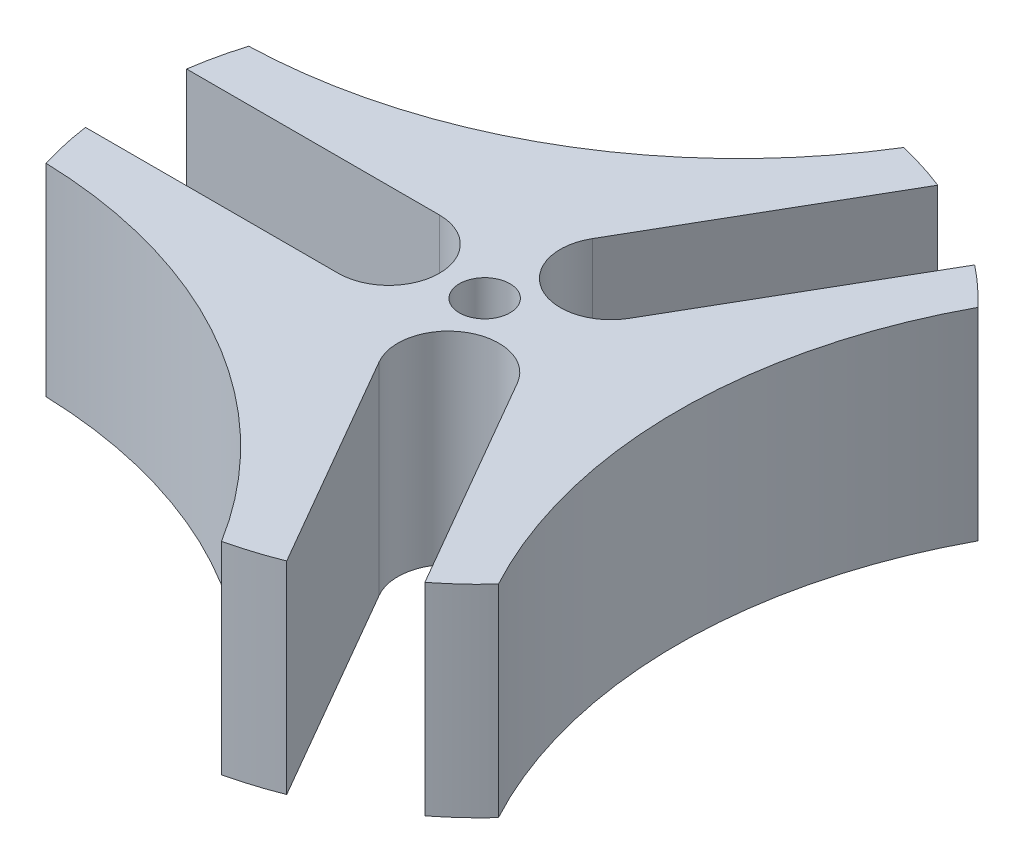
ISO-10303-21;
HEADER;
FILE_DESCRIPTION(('STEP AP214'),'2;1');
FILE_NAME('part.step','',(''),(''),'','','');
FILE_SCHEMA(('AUTOMOTIVE_DESIGN { 1 0 10303 214 1 1 1 1 }'));
ENDSEC;
DATA;
#1=APPLICATION_CONTEXT('core data for automotive mechanical design processes');
#2=APPLICATION_PROTOCOL_DEFINITION('international standard','automotive_design',2000,#1);
#3=PRODUCT_CONTEXT('',#1,'mechanical');
#4=PRODUCT('Part','Part','',(#3));
#5=PRODUCT_RELATED_PRODUCT_CATEGORY('part','',(#4));
#6=PRODUCT_DEFINITION_FORMATION('','',#4);
#7=PRODUCT_DEFINITION_CONTEXT('part definition',#1,'design');
#8=PRODUCT_DEFINITION('design','',#6,#7);
#9=PRODUCT_DEFINITION_SHAPE('','',#8);
#10=(LENGTH_UNIT() NAMED_UNIT(*) SI_UNIT(.MILLI.,.METRE.));
#11=(NAMED_UNIT(*) PLANE_ANGLE_UNIT() SI_UNIT($,.RADIAN.));
#12=(NAMED_UNIT(*) SI_UNIT($,.STERADIAN.) SOLID_ANGLE_UNIT());
#13=UNCERTAINTY_MEASURE_WITH_UNIT(LENGTH_MEASURE(1.E-05),#10,'distance_accuracy_value','');
#14=(GEOMETRIC_REPRESENTATION_CONTEXT(3) GLOBAL_UNCERTAINTY_ASSIGNED_CONTEXT((#13)) GLOBAL_UNIT_ASSIGNED_CONTEXT((#10,
#11,#12)) REPRESENTATION_CONTEXT('',''));
#15=CARTESIAN_POINT('',(0.,0.,0.));
#16=DIRECTION('',(0.,0.,1.));
#17=DIRECTION('',(1.,0.,0.));
#18=AXIS2_PLACEMENT_3D('',#15,#16,#17);
#19=CARTESIAN_POINT('',(0.,10.,0.));
#20=DIRECTION('',(0.,1.,0.));
#21=DIRECTION('',(0.,0.,1.));
#22=AXIS2_PLACEMENT_3D('',#19,#20,#21);
#23=PLANE('',#22);
#24=CARTESIAN_POINT('',(0.,10.,0.));
#25=DIRECTION('',(0.,1.,0.));
#26=DIRECTION('',(0.,0.,1.));
#27=AXIS2_PLACEMENT_3D('',#24,#25,#26);
#28=CIRCLE('',#27,17.3205080756889);
#29=CARTESIAN_POINT('',(10.7346317599624,10.,13.5929276087975));
#30=VERTEX_POINT('',#29);
#31=CARTESIAN_POINT('',(12.6295365612867,10.,11.8530505038629));
#32=VERTEX_POINT('',#31);
#33=EDGE_CURVE('E254',#30,#32,#28,.T.);
#34=ORIENTED_EDGE('',*,*,#33,.T.);
#35=CARTESIAN_POINT('',(34.6410161513775,10.,0.));
#36=DIRECTION('',(0.,-1.,0.));
#37=DIRECTION('',(0.,0.,1.));
#38=AXIS2_PLACEMENT_3D('',#35,#36,#37);
#39=CIRCLE('',#38,25.0000007998422);
#40=CARTESIAN_POINT('',(12.6295365612867,10.,-11.853050503863));
#41=VERTEX_POINT('',#40);
#42=EDGE_CURVE('E130',#32,#41,#39,.T.);
#43=ORIENTED_EDGE('',*,*,#42,.T.);
#44=CARTESIAN_POINT('',(0.,10.,0.));
#45=DIRECTION('',(0.,1.,0.));
#46=DIRECTION('',(0.,0.,1.));
#47=AXIS2_PLACEMENT_3D('',#44,#45,#46);
#48=CIRCLE('',#47,17.3205080756889);
#49=CARTESIAN_POINT('',(10.7346317599625,10.,-13.5929276087975));
#50=VERTEX_POINT('',#49);
#51=EDGE_CURVE('E315',#41,#50,#48,.T.);
#52=ORIENTED_EDGE('',*,*,#51,.T.);
#53=DIRECTION('',(-0.500000000000004,0.,0.866025403784437));
#54=VECTOR('',#53,1.);
#55=CARTESIAN_POINT('',(4.48557158514987,10.,-2.76923788646679));
#56=LINE('',#55,#54);
#57=CARTESIAN_POINT('',(4.48557158514987,10.,-2.76923788646679));
#58=VERTEX_POINT('',#57);
#59=EDGE_CURVE('E335',#50,#58,#56,.T.);
#60=ORIENTED_EDGE('',*,*,#59,.T.);
#61=CARTESIAN_POINT('',(2.32050807568883,10.,-4.0192378864669));
#62=DIRECTION('',(0.,-1.,0.));
#63=DIRECTION('',(0.,0.,1.));
#64=AXIS2_PLACEMENT_3D('',#61,#62,#63);
#65=CIRCLE('',#64,2.5);
#66=CARTESIAN_POINT('',(0.155444566227742,10.,-5.26923788646692));
#67=VERTEX_POINT('',#66);
#68=EDGE_CURVE('E331',#58,#67,#65,.T.);
#69=ORIENTED_EDGE('',*,*,#68,.T.);
#70=DIRECTION('',(0.500000000000004,0.,-0.866025403784436));
#71=VECTOR('',#70,1.);
#72=CARTESIAN_POINT('',(0.155444566227745,10.,-5.26923788646692));
#73=LINE('',#72,#71);
#74=CARTESIAN_POINT('',(6.40450474104034,10.,-16.0929276087975));
#75=VERTEX_POINT('',#74);
#76=EDGE_CURVE('E334',#67,#75,#73,.T.);
#77=ORIENTED_EDGE('',*,*,#76,.T.);
#78=CARTESIAN_POINT('',(0.,10.,0.));
#79=DIRECTION('',(0.,1.,0.));
#80=DIRECTION('',(0.,0.,1.));
#81=AXIS2_PLACEMENT_3D('',#78,#79,#80);
#82=CIRCLE('',#81,17.3205080756889);
#83=CARTESIAN_POINT('',(3.95027456804292,10.,-16.8640247520299));
#84=VERTEX_POINT('',#83);
#85=EDGE_CURVE('E339',#75,#84,#82,.T.);
#86=ORIENTED_EDGE('',*,*,#85,.T.);
#87=CARTESIAN_POINT('',(-17.3205080756893,10.,-30.0000000000009));
#88=DIRECTION('',(0.,-1.,0.));
#89=DIRECTION('',(0.,0.,1.));
#90=AXIS2_PLACEMENT_3D('',#87,#88,#89);
#91=CIRCLE('',#90,25.0000007998436);
#92=CARTESIAN_POINT('',(-16.5798111293286,10.,-5.01097424816672));
#93=VERTEX_POINT('',#92);
#94=EDGE_CURVE('E346',#84,#93,#91,.T.);
#95=ORIENTED_EDGE('',*,*,#94,.T.);
#96=CARTESIAN_POINT('',(0.,10.,0.));
#97=DIRECTION('',(0.,1.,0.));
#98=DIRECTION('',(0.,0.,1.));
#99=AXIS2_PLACEMENT_3D('',#96,#97,#98);
#100=CIRCLE('',#99,17.3205080756889);
#101=CARTESIAN_POINT('',(-17.1391365010027,10.,-2.50000000000008));
#102=VERTEX_POINT('',#101);
#103=EDGE_CURVE('E349',#93,#102,#100,.T.);
#104=ORIENTED_EDGE('',*,*,#103,.T.);
#105=DIRECTION('',(1.,0.,0.));
#106=VECTOR('',#105,1.);
#107=CARTESIAN_POINT('',(-4.64101615137761,10.,-2.50000000000002));
#108=LINE('',#107,#106);
#109=CARTESIAN_POINT('',(-4.64101615137761,10.,-2.50000000000002));
#110=VERTEX_POINT('',#109);
#111=EDGE_CURVE('E352',#102,#110,#108,.T.);
#112=ORIENTED_EDGE('',*,*,#111,.T.);
#113=CARTESIAN_POINT('',(-4.64101615137752,10.,0.));
#114=DIRECTION('',(0.,-1.,0.));
#115=DIRECTION('',(0.,0.,1.));
#116=AXIS2_PLACEMENT_3D('',#113,#114,#115);
#117=CIRCLE('',#116,2.5);
#118=CARTESIAN_POINT('',(-4.64101615137763,10.,2.49999999999998));
#119=VERTEX_POINT('',#118);
#120=EDGE_CURVE('E355',#110,#119,#117,.T.);
#121=ORIENTED_EDGE('',*,*,#120,.T.);
#122=DIRECTION('',(-1.,0.,0.));
#123=VECTOR('',#122,1.);
#124=CARTESIAN_POINT('',(-4.64101615137763,10.,2.49999999999998));
#125=LINE('',#124,#123);
#126=CARTESIAN_POINT('',(-17.1391365010027,10.,2.49999999999992));
#127=VERTEX_POINT('',#126);
#128=EDGE_CURVE('E358',#119,#127,#125,.T.);
#129=ORIENTED_EDGE('',*,*,#128,.T.);
#130=CARTESIAN_POINT('',(0.,10.,0.));
#131=DIRECTION('',(0.,1.,0.));
#132=DIRECTION('',(0.,0.,1.));
#133=AXIS2_PLACEMENT_3D('',#130,#131,#132);
#134=CIRCLE('',#133,17.3205080756889);
#135=CARTESIAN_POINT('',(-16.5798111293286,10.,5.01097424816726));
#136=VERTEX_POINT('',#135);
#137=EDGE_CURVE('E361',#127,#136,#134,.T.);
#138=ORIENTED_EDGE('',*,*,#137,.T.);
#139=CARTESIAN_POINT('',(-17.3205080756893,10.,30.0000000000009));
#140=DIRECTION('',(0.,-1.,0.));
#141=DIRECTION('',(0.,0.,1.));
#142=AXIS2_PLACEMENT_3D('',#139,#140,#141);
#143=CIRCLE('',#142,25.000000799843);
#144=CARTESIAN_POINT('',(3.95027456804184,10.,16.8640247520302));
#145=VERTEX_POINT('',#144);
#146=EDGE_CURVE('E364',#136,#145,#143,.T.);
#147=ORIENTED_EDGE('',*,*,#146,.T.);
#148=CARTESIAN_POINT('',(0.,10.,0.));
#149=DIRECTION('',(0.,1.,0.));
#150=DIRECTION('',(0.,0.,1.));
#151=AXIS2_PLACEMENT_3D('',#148,#149,#150);
#152=CIRCLE('',#151,17.3205080756889);
#153=CARTESIAN_POINT('',(6.40450474104021,10.,16.0929276087975));
#154=VERTEX_POINT('',#153);
#155=EDGE_CURVE('E179',#145,#154,#152,.T.);
#156=ORIENTED_EDGE('',*,*,#155,.T.);
#157=DIRECTION('',(-0.499999999999997,0.,-0.866025403784441));
#158=VECTOR('',#157,1.);
#159=CARTESIAN_POINT('',(0.155444566227636,10.,5.26923788646682));
#160=LINE('',#159,#158);
#161=CARTESIAN_POINT('',(0.155444566227636,10.,5.26923788646682));
#162=VERTEX_POINT('',#161);
#163=EDGE_CURVE('E173',#154,#162,#160,.T.);
#164=ORIENTED_EDGE('',*,*,#163,.T.);
#165=CARTESIAN_POINT('',(2.32050807568874,10.,4.01923788646683));
#166=DIRECTION('',(0.,-1.,0.));
#167=DIRECTION('',(0.,0.,1.));
#168=AXIS2_PLACEMENT_3D('',#165,#166,#167);
#169=CIRCLE('',#168,2.5);
#170=CARTESIAN_POINT('',(4.48557158514984,10.,2.76923788646684));
#171=VERTEX_POINT('',#170);
#172=EDGE_CURVE('E177',#162,#171,#169,.T.);
#173=ORIENTED_EDGE('',*,*,#172,.T.);
#174=DIRECTION('',(0.499999999999997,0.,0.86602540378444));
#175=VECTOR('',#174,1.);
#176=CARTESIAN_POINT('',(4.48557158514984,10.,2.76923788646684));
#177=LINE('',#176,#175);
#178=EDGE_CURVE('E57',#171,#30,#177,.T.);
#179=ORIENTED_EDGE('',*,*,#178,.T.);
#180=EDGE_LOOP('',(#34,#43,#52,#60,#69,#77,#86,#95,#104,#112,#121,#129,#138,#147,#156,#164,#173,#179));
#181=FACE_BOUND('',#180,.T.);
#182=CARTESIAN_POINT('',(0.0485582712700609,10.,-0.0502712215943359));
#183=DIRECTION('',(0.,1.,0.));
#184=DIRECTION('',(0.,0.,1.));
#185=AXIS2_PLACEMENT_3D('',#182,#183,#184);
#186=CIRCLE('',#185,1.25);
#187=CARTESIAN_POINT('',(0.0485582712700609,10.,1.19972877840566));
#188=VERTEX_POINT('',#187);
#189=EDGE_CURVE('E206',#188,#188,#186,.T.);
#190=ORIENTED_EDGE('',*,*,#189,.F.);
#191=EDGE_LOOP('',(#190));
#192=FACE_BOUND('',#191,.T.);
#193=ADVANCED_FACE('F39',(#181,#192),#23,.T.);
#194=CARTESIAN_POINT('',(0.,0.,0.));
#195=DIRECTION('',(0.,1.,0.));
#196=DIRECTION('',(0.,0.,1.));
#197=AXIS2_PLACEMENT_3D('',#194,#195,#196);
#198=PLANE('',#197);
#199=CARTESIAN_POINT('',(0.,0.,0.));
#200=DIRECTION('',(0.,1.,0.));
#201=DIRECTION('',(0.,0.,1.));
#202=AXIS2_PLACEMENT_3D('',#199,#200,#201);
#203=CIRCLE('',#202,17.3205080756889);
#204=CARTESIAN_POINT('',(10.7346317599624,0.,13.5929276087975));
#205=VERTEX_POINT('',#204);
#206=CARTESIAN_POINT('',(12.6295365612867,0.,11.8530505038629));
#207=VERTEX_POINT('',#206);
#208=EDGE_CURVE('E201',#205,#207,#203,.T.);
#209=ORIENTED_EDGE('',*,*,#208,.F.);
#210=DIRECTION('',(0.499999999999997,0.,0.86602540378444));
#211=VECTOR('',#210,1.);
#212=CARTESIAN_POINT('',(4.48557158514984,0.,2.76923788646684));
#213=LINE('',#212,#211);
#214=CARTESIAN_POINT('',(4.48557158514984,0.,2.76923788646684));
#215=VERTEX_POINT('',#214);
#216=EDGE_CURVE('E122',#215,#205,#213,.T.);
#217=ORIENTED_EDGE('',*,*,#216,.F.);
#218=CARTESIAN_POINT('',(2.32050807568874,0.,4.01923788646683));
#219=DIRECTION('',(0.,-1.,0.));
#220=DIRECTION('',(0.,0.,1.));
#221=AXIS2_PLACEMENT_3D('',#218,#219,#220);
#222=CIRCLE('',#221,2.5);
#223=CARTESIAN_POINT('',(0.155444566227636,0.,5.26923788646682));
#224=VERTEX_POINT('',#223);
#225=EDGE_CURVE('E116',#224,#215,#222,.T.);
#226=ORIENTED_EDGE('',*,*,#225,.F.);
#227=DIRECTION('',(-0.499999999999997,0.,-0.866025403784441));
#228=VECTOR('',#227,1.);
#229=CARTESIAN_POINT('',(0.155444566227636,0.,5.26923788646682));
#230=LINE('',#229,#228);
#231=CARTESIAN_POINT('',(6.40450474104021,0.,16.0929276087975));
#232=VERTEX_POINT('',#231);
#233=EDGE_CURVE('E188',#232,#224,#230,.T.);
#234=ORIENTED_EDGE('',*,*,#233,.F.);
#235=CARTESIAN_POINT('',(0.,0.,0.));
#236=DIRECTION('',(0.,1.,0.));
#237=DIRECTION('',(0.,0.,1.));
#238=AXIS2_PLACEMENT_3D('',#235,#236,#237);
#239=CIRCLE('',#238,17.3205080756889);
#240=CARTESIAN_POINT('',(3.95027456804184,0.,16.8640247520302));
#241=VERTEX_POINT('',#240);
#242=EDGE_CURVE('E245',#241,#232,#239,.T.);
#243=ORIENTED_EDGE('',*,*,#242,.F.);
#244=CARTESIAN_POINT('',(-17.3205080756893,0.,30.0000000000009));
#245=DIRECTION('',(0.,-1.,0.));
#246=DIRECTION('',(0.,0.,1.));
#247=AXIS2_PLACEMENT_3D('',#244,#245,#246);
#248=CIRCLE('',#247,25.000000799843);
#249=CARTESIAN_POINT('',(-16.5798111293286,0.,5.01097424816726));
#250=VERTEX_POINT('',#249);
#251=EDGE_CURVE('E242',#250,#241,#248,.T.);
#252=ORIENTED_EDGE('',*,*,#251,.F.);
#253=CARTESIAN_POINT('',(0.,0.,0.));
#254=DIRECTION('',(0.,1.,0.));
#255=DIRECTION('',(0.,0.,1.));
#256=AXIS2_PLACEMENT_3D('',#253,#254,#255);
#257=CIRCLE('',#256,17.3205080756889);
#258=CARTESIAN_POINT('',(-17.1391365010027,0.,2.49999999999992));
#259=VERTEX_POINT('',#258);
#260=EDGE_CURVE('E239',#259,#250,#257,.T.);
#261=ORIENTED_EDGE('',*,*,#260,.F.);
#262=DIRECTION('',(-1.,0.,0.));
#263=VECTOR('',#262,1.);
#264=CARTESIAN_POINT('',(-4.64101615137763,0.,2.49999999999998));
#265=LINE('',#264,#263);
#266=CARTESIAN_POINT('',(-4.64101615137763,0.,2.49999999999998));
#267=VERTEX_POINT('',#266);
#268=EDGE_CURVE('E236',#267,#259,#265,.T.);
#269=ORIENTED_EDGE('',*,*,#268,.F.);
#270=CARTESIAN_POINT('',(-4.64101615137752,0.,0.));
#271=DIRECTION('',(0.,-1.,0.));
#272=DIRECTION('',(0.,0.,1.));
#273=AXIS2_PLACEMENT_3D('',#270,#271,#272);
#274=CIRCLE('',#273,2.5);
#275=CARTESIAN_POINT('',(-4.64101615137761,0.,-2.50000000000002));
#276=VERTEX_POINT('',#275);
#277=EDGE_CURVE('E233',#276,#267,#274,.T.);
#278=ORIENTED_EDGE('',*,*,#277,.F.);
#279=DIRECTION('',(1.,0.,0.));
#280=VECTOR('',#279,1.);
#281=CARTESIAN_POINT('',(-4.64101615137761,0.,-2.50000000000002));
#282=LINE('',#281,#280);
#283=CARTESIAN_POINT('',(-17.1391365010027,0.,-2.50000000000008));
#284=VERTEX_POINT('',#283);
#285=EDGE_CURVE('E230',#284,#276,#282,.T.);
#286=ORIENTED_EDGE('',*,*,#285,.F.);
#287=CARTESIAN_POINT('',(0.,0.,0.));
#288=DIRECTION('',(0.,1.,0.));
#289=DIRECTION('',(0.,0.,1.));
#290=AXIS2_PLACEMENT_3D('',#287,#288,#289);
#291=CIRCLE('',#290,17.3205080756889);
#292=CARTESIAN_POINT('',(-16.5798111293286,0.,-5.01097424816672));
#293=VERTEX_POINT('',#292);
#294=EDGE_CURVE('E227',#293,#284,#291,.T.);
#295=ORIENTED_EDGE('',*,*,#294,.F.);
#296=CARTESIAN_POINT('',(-17.3205080756893,0.,-30.0000000000009));
#297=DIRECTION('',(0.,-1.,0.));
#298=DIRECTION('',(0.,0.,1.));
#299=AXIS2_PLACEMENT_3D('',#296,#297,#298);
#300=CIRCLE('',#299,25.0000007998436);
#301=CARTESIAN_POINT('',(3.95027456804292,0.,-16.8640247520299));
#302=VERTEX_POINT('',#301);
#303=EDGE_CURVE('E224',#302,#293,#300,.T.);
#304=ORIENTED_EDGE('',*,*,#303,.F.);
#305=CARTESIAN_POINT('',(0.,0.,0.));
#306=DIRECTION('',(0.,1.,0.));
#307=DIRECTION('',(0.,0.,1.));
#308=AXIS2_PLACEMENT_3D('',#305,#306,#307);
#309=CIRCLE('',#308,17.3205080756889);
#310=CARTESIAN_POINT('',(6.40450474104034,0.,-16.0929276087975));
#311=VERTEX_POINT('',#310);
#312=EDGE_CURVE('E221',#311,#302,#309,.T.);
#313=ORIENTED_EDGE('',*,*,#312,.F.);
#314=DIRECTION('',(0.500000000000004,0.,-0.866025403784436));
#315=VECTOR('',#314,1.);
#316=CARTESIAN_POINT('',(0.155444566227745,0.,-5.26923788646692));
#317=LINE('',#316,#315);
#318=CARTESIAN_POINT('',(0.155444566227742,0.,-5.26923788646692));
#319=VERTEX_POINT('',#318);
#320=EDGE_CURVE('E218',#319,#311,#317,.T.);
#321=ORIENTED_EDGE('',*,*,#320,.F.);
#322=CARTESIAN_POINT('',(2.32050807568883,0.,-4.0192378864669));
#323=DIRECTION('',(0.,-1.,0.));
#324=DIRECTION('',(0.,0.,1.));
#325=AXIS2_PLACEMENT_3D('',#322,#323,#324);
#326=CIRCLE('',#325,2.5);
#327=CARTESIAN_POINT('',(4.48557158514987,0.,-2.76923788646679));
#328=VERTEX_POINT('',#327);
#329=EDGE_CURVE('E215',#328,#319,#326,.T.);
#330=ORIENTED_EDGE('',*,*,#329,.F.);
#331=DIRECTION('',(-0.500000000000004,0.,0.866025403784437));
#332=VECTOR('',#331,1.);
#333=CARTESIAN_POINT('',(4.48557158514987,0.,-2.76923788646679));
#334=LINE('',#333,#332);
#335=CARTESIAN_POINT('',(10.7346317599625,0.,-13.5929276087975));
#336=VERTEX_POINT('',#335);
#337=EDGE_CURVE('E212',#336,#328,#334,.T.);
#338=ORIENTED_EDGE('',*,*,#337,.F.);
#339=CARTESIAN_POINT('',(0.,0.,0.));
#340=DIRECTION('',(0.,1.,0.));
#341=DIRECTION('',(0.,0.,1.));
#342=AXIS2_PLACEMENT_3D('',#339,#340,#341);
#343=CIRCLE('',#342,17.3205080756889);
#344=CARTESIAN_POINT('',(12.6295365612867,0.,-11.853050503863));
#345=VERTEX_POINT('',#344);
#346=EDGE_CURVE('E209',#345,#336,#343,.T.);
#347=ORIENTED_EDGE('',*,*,#346,.F.);
#348=CARTESIAN_POINT('',(34.6410161513775,0.,0.));
#349=DIRECTION('',(0.,-1.,0.));
#350=DIRECTION('',(0.,0.,1.));
#351=AXIS2_PLACEMENT_3D('',#348,#349,#350);
#352=CIRCLE('',#351,25.0000007998422);
#353=EDGE_CURVE('E205',#207,#345,#352,.T.);
#354=ORIENTED_EDGE('',*,*,#353,.F.);
#355=EDGE_LOOP('',(#209,#217,#226,#234,#243,#252,#261,#269,#278,#286,#295,#304,#313,#321,#330,
#338,#347,#354));
#356=FACE_BOUND('',#355,.T.);
#357=CARTESIAN_POINT('',(0.0485582712700609,0.,-0.0502712215943359));
#358=DIRECTION('',(0.,1.,0.));
#359=DIRECTION('',(0.,0.,1.));
#360=AXIS2_PLACEMENT_3D('',#357,#358,#359);
#361=CIRCLE('',#360,1.25);
#362=CARTESIAN_POINT('',(0.0485582712700609,0.,1.19972877840566));
#363=VERTEX_POINT('',#362);
#364=EDGE_CURVE('E591',#363,#363,#361,.T.);
#365=ORIENTED_EDGE('',*,*,#364,.T.);
#366=EDGE_LOOP('',(#365));
#367=FACE_BOUND('',#366,.T.);
#368=ADVANCED_FACE('F319',(#356,#367),#198,.F.);
#369=CARTESIAN_POINT('',(0.,10.,0.));
#370=DIRECTION('',(0.,-1.,0.));
#371=DIRECTION('',(0.,0.,-1.));
#372=AXIS2_PLACEMENT_3D('',#369,#370,#371);
#373=CYLINDRICAL_SURFACE('',#372,17.3205080756889);
#374=ORIENTED_EDGE('',*,*,#208,.T.);
#375=DIRECTION('',(0.,-1.,0.));
#376=VECTOR('',#375,1.);
#377=CARTESIAN_POINT('',(12.6295365612867,10.,11.8530505038629));
#378=LINE('',#377,#376);
#379=EDGE_CURVE('E11',#32,#207,#378,.T.);
#380=ORIENTED_EDGE('',*,*,#379,.F.);
#381=ORIENTED_EDGE('',*,*,#33,.F.);
#382=DIRECTION('',(0.,-1.,0.));
#383=VECTOR('',#382,1.);
#384=CARTESIAN_POINT('',(10.7346317599624,10.,13.5929276087975));
#385=LINE('',#384,#383);
#386=EDGE_CURVE('E197',#30,#205,#385,.T.);
#387=ORIENTED_EDGE('',*,*,#386,.T.);
#388=EDGE_LOOP('',(#374,#380,#381,#387));
#389=FACE_BOUND('',#388,.T.);
#390=ADVANCED_FACE('F41',(#389),#373,.T.);
#391=CARTESIAN_POINT('',(34.6410161513775,10.,0.));
#392=DIRECTION('',(0.,-1.,0.));
#393=DIRECTION('',(0.,0.,-1.));
#394=AXIS2_PLACEMENT_3D('',#391,#392,#393);
#395=CYLINDRICAL_SURFACE('',#394,25.0000007998422);
#396=ORIENTED_EDGE('',*,*,#353,.T.);
#397=DIRECTION('',(0.,-1.,0.));
#398=VECTOR('',#397,1.);
#399=CARTESIAN_POINT('',(12.6295365612867,10.,-11.853050503863));
#400=LINE('',#399,#398);
#401=EDGE_CURVE('E49',#41,#345,#400,.T.);
#402=ORIENTED_EDGE('',*,*,#401,.F.);
#403=ORIENTED_EDGE('',*,*,#42,.F.);
#404=ORIENTED_EDGE('',*,*,#379,.T.);
#405=EDGE_LOOP('',(#396,#402,#403,#404));
#406=FACE_BOUND('',#405,.T.);
#407=ADVANCED_FACE('F400',(#406),#395,.F.);
#408=CARTESIAN_POINT('',(0.,10.,0.));
#409=DIRECTION('',(0.,-1.,0.));
#410=DIRECTION('',(0.,0.,-1.));
#411=AXIS2_PLACEMENT_3D('',#408,#409,#410);
#412=CYLINDRICAL_SURFACE('',#411,17.3205080756889);
#413=ORIENTED_EDGE('',*,*,#346,.T.);
#414=DIRECTION('',(0.,-1.,0.));
#415=VECTOR('',#414,1.);
#416=CARTESIAN_POINT('',(10.7346317599625,10.,-13.5929276087975));
#417=LINE('',#416,#415);
#418=EDGE_CURVE('E305',#50,#336,#417,.T.);
#419=ORIENTED_EDGE('',*,*,#418,.F.);
#420=ORIENTED_EDGE('',*,*,#51,.F.);
#421=ORIENTED_EDGE('',*,*,#401,.T.);
#422=EDGE_LOOP('',(#413,#419,#420,#421));
#423=FACE_BOUND('',#422,.T.);
#424=ADVANCED_FACE('F313',(#423),#412,.T.);
#425=CARTESIAN_POINT('',(4.48557158514987,10.,-2.76923788646679));
#426=DIRECTION('',(0.866025403784437,0.,0.500000000000004));
#427=DIRECTION('',(0.500000000000004,0.,-0.866025403784437));
#428=AXIS2_PLACEMENT_3D('',#425,#426,#427);
#429=PLANE('',#428);
#430=ORIENTED_EDGE('',*,*,#337,.T.);
#431=DIRECTION('',(0.,-1.,0.));
#432=VECTOR('',#431,1.);
#433=CARTESIAN_POINT('',(4.48557158514987,10.,-2.76923788646679));
#434=LINE('',#433,#432);
#435=EDGE_CURVE('E301',#58,#328,#434,.T.);
#436=ORIENTED_EDGE('',*,*,#435,.F.);
#437=ORIENTED_EDGE('',*,*,#59,.F.);
#438=ORIENTED_EDGE('',*,*,#418,.T.);
#439=EDGE_LOOP('',(#430,#436,#437,#438));
#440=FACE_BOUND('',#439,.T.);
#441=ADVANCED_FACE('F325',(#440),#429,.F.);
#442=CARTESIAN_POINT('',(2.32050807568883,10.,-4.0192378864669));
#443=DIRECTION('',(0.,-1.,0.));
#444=DIRECTION('',(0.,0.,-1.));
#445=AXIS2_PLACEMENT_3D('',#442,#443,#444);
#446=CYLINDRICAL_SURFACE('',#445,2.5);
#447=ORIENTED_EDGE('',*,*,#329,.T.);
#448=DIRECTION('',(0.,-1.,0.));
#449=VECTOR('',#448,1.);
#450=CARTESIAN_POINT('',(0.155444566227742,10.,-5.26923788646692));
#451=LINE('',#450,#449);
#452=EDGE_CURVE('E297',#67,#319,#451,.T.);
#453=ORIENTED_EDGE('',*,*,#452,.F.);
#454=ORIENTED_EDGE('',*,*,#68,.F.);
#455=ORIENTED_EDGE('',*,*,#435,.T.);
#456=EDGE_LOOP('',(#447,#453,#454,#455));
#457=FACE_BOUND('',#456,.T.);
#458=ADVANCED_FACE('F329',(#457),#446,.F.);
#459=CARTESIAN_POINT('',(0.155444566227745,10.,-5.26923788646692));
#460=DIRECTION('',(-0.866025403784437,0.,-0.500000000000004));
#461=DIRECTION('',(-0.500000000000004,0.,0.866025403784437));
#462=AXIS2_PLACEMENT_3D('',#459,#460,#461);
#463=PLANE('',#462);
#464=ORIENTED_EDGE('',*,*,#320,.T.);
#465=DIRECTION('',(0.,-1.,0.));
#466=VECTOR('',#465,1.);
#467=CARTESIAN_POINT('',(6.40450474104034,10.,-16.0929276087975));
#468=LINE('',#467,#466);
#469=EDGE_CURVE('E293',#75,#311,#468,.T.);
#470=ORIENTED_EDGE('',*,*,#469,.F.);
#471=ORIENTED_EDGE('',*,*,#76,.F.);
#472=ORIENTED_EDGE('',*,*,#452,.T.);
#473=EDGE_LOOP('',(#464,#470,#471,#472));
#474=FACE_BOUND('',#473,.T.);
#475=ADVANCED_FACE('F413',(#474),#463,.F.);
#476=CARTESIAN_POINT('',(0.,10.,0.));
#477=DIRECTION('',(0.,-1.,0.));
#478=DIRECTION('',(0.,0.,-1.));
#479=AXIS2_PLACEMENT_3D('',#476,#477,#478);
#480=CYLINDRICAL_SURFACE('',#479,17.3205080756889);
#481=ORIENTED_EDGE('',*,*,#312,.T.);
#482=DIRECTION('',(0.,-1.,0.));
#483=VECTOR('',#482,1.);
#484=CARTESIAN_POINT('',(3.95027456804292,10.,-16.8640247520299));
#485=LINE('',#484,#483);
#486=EDGE_CURVE('E289',#84,#302,#485,.T.);
#487=ORIENTED_EDGE('',*,*,#486,.F.);
#488=ORIENTED_EDGE('',*,*,#85,.F.);
#489=ORIENTED_EDGE('',*,*,#469,.T.);
#490=EDGE_LOOP('',(#481,#487,#488,#489));
#491=FACE_BOUND('',#490,.T.);
#492=ADVANCED_FACE('F416',(#491),#480,.T.);
#493=CARTESIAN_POINT('',(-17.3205080756893,10.,-30.0000000000009));
#494=DIRECTION('',(0.,-1.,0.));
#495=DIRECTION('',(0.,0.,-1.));
#496=AXIS2_PLACEMENT_3D('',#493,#494,#495);
#497=CYLINDRICAL_SURFACE('',#496,25.0000007998436);
#498=ORIENTED_EDGE('',*,*,#303,.T.);
#499=DIRECTION('',(0.,-1.,0.));
#500=VECTOR('',#499,1.);
#501=CARTESIAN_POINT('',(-16.5798111293286,10.,-5.01097424816672));
#502=LINE('',#501,#500);
#503=EDGE_CURVE('E285',#93,#293,#502,.T.);
#504=ORIENTED_EDGE('',*,*,#503,.F.);
#505=ORIENTED_EDGE('',*,*,#94,.F.);
#506=ORIENTED_EDGE('',*,*,#486,.T.);
#507=EDGE_LOOP('',(#498,#504,#505,#506));
#508=FACE_BOUND('',#507,.T.);
#509=ADVANCED_FACE('F420',(#508),#497,.F.);
#510=CARTESIAN_POINT('',(0.,10.,0.));
#511=DIRECTION('',(0.,-1.,0.));
#512=DIRECTION('',(0.,0.,-1.));
#513=AXIS2_PLACEMENT_3D('',#510,#511,#512);
#514=CYLINDRICAL_SURFACE('',#513,17.3205080756889);
#515=ORIENTED_EDGE('',*,*,#294,.T.);
#516=DIRECTION('',(0.,-1.,0.));
#517=VECTOR('',#516,1.);
#518=CARTESIAN_POINT('',(-17.1391365010027,10.,-2.50000000000008));
#519=LINE('',#518,#517);
#520=EDGE_CURVE('E281',#102,#284,#519,.T.);
#521=ORIENTED_EDGE('',*,*,#520,.F.);
#522=ORIENTED_EDGE('',*,*,#103,.F.);
#523=ORIENTED_EDGE('',*,*,#503,.T.);
#524=EDGE_LOOP('',(#515,#521,#522,#523));
#525=FACE_BOUND('',#524,.T.);
#526=ADVANCED_FACE('F424',(#525),#514,.T.);
#527=CARTESIAN_POINT('',(-4.64101615137761,10.,-2.50000000000002));
#528=DIRECTION('',(0.,0.,-1.));
#529=DIRECTION('',(-1.,0.,0.));
#530=AXIS2_PLACEMENT_3D('',#527,#528,#529);
#531=PLANE('',#530);
#532=ORIENTED_EDGE('',*,*,#285,.T.);
#533=DIRECTION('',(0.,-1.,0.));
#534=VECTOR('',#533,1.);
#535=CARTESIAN_POINT('',(-4.64101615137761,10.,-2.50000000000002));
#536=LINE('',#535,#534);
#537=EDGE_CURVE('E277',#110,#276,#536,.T.);
#538=ORIENTED_EDGE('',*,*,#537,.F.);
#539=ORIENTED_EDGE('',*,*,#111,.F.);
#540=ORIENTED_EDGE('',*,*,#520,.T.);
#541=EDGE_LOOP('',(#532,#538,#539,#540));
#542=FACE_BOUND('',#541,.T.);
#543=ADVANCED_FACE('F428',(#542),#531,.F.);
#544=CARTESIAN_POINT('',(-4.64101615137752,10.,0.));
#545=DIRECTION('',(0.,-1.,0.));
#546=DIRECTION('',(0.,0.,-1.));
#547=AXIS2_PLACEMENT_3D('',#544,#545,#546);
#548=CYLINDRICAL_SURFACE('',#547,2.5);
#549=ORIENTED_EDGE('',*,*,#277,.T.);
#550=DIRECTION('',(0.,-1.,0.));
#551=VECTOR('',#550,1.);
#552=CARTESIAN_POINT('',(-4.64101615137763,10.,2.49999999999998));
#553=LINE('',#552,#551);
#554=EDGE_CURVE('E273',#119,#267,#553,.T.);
#555=ORIENTED_EDGE('',*,*,#554,.F.);
#556=ORIENTED_EDGE('',*,*,#120,.F.);
#557=ORIENTED_EDGE('',*,*,#537,.T.);
#558=EDGE_LOOP('',(#549,#555,#556,#557));
#559=FACE_BOUND('',#558,.T.);
#560=ADVANCED_FACE('F432',(#559),#548,.F.);
#561=CARTESIAN_POINT('',(-4.64101615137763,10.,2.49999999999998));
#562=DIRECTION('',(0.,0.,1.));
#563=DIRECTION('',(1.,0.,0.));
#564=AXIS2_PLACEMENT_3D('',#561,#562,#563);
#565=PLANE('',#564);
#566=ORIENTED_EDGE('',*,*,#268,.T.);
#567=DIRECTION('',(0.,-1.,0.));
#568=VECTOR('',#567,1.);
#569=CARTESIAN_POINT('',(-17.1391365010027,10.,2.49999999999992));
#570=LINE('',#569,#568);
#571=EDGE_CURVE('E269',#127,#259,#570,.T.);
#572=ORIENTED_EDGE('',*,*,#571,.F.);
#573=ORIENTED_EDGE('',*,*,#128,.F.);
#574=ORIENTED_EDGE('',*,*,#554,.T.);
#575=EDGE_LOOP('',(#566,#572,#573,#574));
#576=FACE_BOUND('',#575,.T.);
#577=ADVANCED_FACE('F436',(#576),#565,.F.);
#578=CARTESIAN_POINT('',(0.,10.,0.));
#579=DIRECTION('',(0.,-1.,0.));
#580=DIRECTION('',(0.,0.,-1.));
#581=AXIS2_PLACEMENT_3D('',#578,#579,#580);
#582=CYLINDRICAL_SURFACE('',#581,17.3205080756889);
#583=ORIENTED_EDGE('',*,*,#260,.T.);
#584=DIRECTION('',(0.,-1.,0.));
#585=VECTOR('',#584,1.);
#586=CARTESIAN_POINT('',(-16.5798111293286,10.,5.01097424816726));
#587=LINE('',#586,#585);
#588=EDGE_CURVE('E265',#136,#250,#587,.T.);
#589=ORIENTED_EDGE('',*,*,#588,.F.);
#590=ORIENTED_EDGE('',*,*,#137,.F.);
#591=ORIENTED_EDGE('',*,*,#571,.T.);
#592=EDGE_LOOP('',(#583,#589,#590,#591));
#593=FACE_BOUND('',#592,.T.);
#594=ADVANCED_FACE('F440',(#593),#582,.T.);
#595=CARTESIAN_POINT('',(-17.3205080756893,10.,30.0000000000009));
#596=DIRECTION('',(0.,-1.,0.));
#597=DIRECTION('',(0.,0.,-1.));
#598=AXIS2_PLACEMENT_3D('',#595,#596,#597);
#599=CYLINDRICAL_SURFACE('',#598,25.000000799843);
#600=ORIENTED_EDGE('',*,*,#251,.T.);
#601=DIRECTION('',(0.,-1.,0.));
#602=VECTOR('',#601,1.);
#603=CARTESIAN_POINT('',(3.95027456804184,10.,16.8640247520302));
#604=LINE('',#603,#602);
#605=EDGE_CURVE('E261',#145,#241,#604,.T.);
#606=ORIENTED_EDGE('',*,*,#605,.F.);
#607=ORIENTED_EDGE('',*,*,#146,.F.);
#608=ORIENTED_EDGE('',*,*,#588,.T.);
#609=EDGE_LOOP('',(#600,#606,#607,#608));
#610=FACE_BOUND('',#609,.T.);
#611=ADVANCED_FACE('F372',(#610),#599,.F.);
#612=CARTESIAN_POINT('',(0.,10.,0.));
#613=DIRECTION('',(0.,-1.,0.));
#614=DIRECTION('',(0.,0.,-1.));
#615=AXIS2_PLACEMENT_3D('',#612,#613,#614);
#616=CYLINDRICAL_SURFACE('',#615,17.3205080756889);
#617=ORIENTED_EDGE('',*,*,#242,.T.);
#618=DIRECTION('',(0.,-1.,0.));
#619=VECTOR('',#618,1.);
#620=CARTESIAN_POINT('',(6.40450474104021,10.,16.0929276087975));
#621=LINE('',#620,#619);
#622=EDGE_CURVE('E190',#154,#232,#621,.T.);
#623=ORIENTED_EDGE('',*,*,#622,.F.);
#624=ORIENTED_EDGE('',*,*,#155,.F.);
#625=ORIENTED_EDGE('',*,*,#605,.T.);
#626=EDGE_LOOP('',(#617,#623,#624,#625));
#627=FACE_BOUND('',#626,.T.);
#628=ADVANCED_FACE('F376',(#627),#616,.T.);
#629=CARTESIAN_POINT('',(0.155444566227636,10.,5.26923788646682));
#630=DIRECTION('',(-0.866025403784441,0.,0.499999999999997));
#631=DIRECTION('',(0.499999999999997,0.,0.866025403784441));
#632=AXIS2_PLACEMENT_3D('',#629,#630,#631);
#633=PLANE('',#632);
#634=ORIENTED_EDGE('',*,*,#233,.T.);
#635=DIRECTION('',(0.,-1.,0.));
#636=VECTOR('',#635,1.);
#637=CARTESIAN_POINT('',(0.155444566227636,10.,5.26923788646682));
#638=LINE('',#637,#636);
#639=EDGE_CURVE('E185',#162,#224,#638,.T.);
#640=ORIENTED_EDGE('',*,*,#639,.F.);
#641=ORIENTED_EDGE('',*,*,#163,.F.);
#642=ORIENTED_EDGE('',*,*,#622,.T.);
#643=EDGE_LOOP('',(#634,#640,#641,#642));
#644=FACE_BOUND('',#643,.T.);
#645=ADVANCED_FACE('F186',(#644),#633,.F.);
#646=CARTESIAN_POINT('',(2.32050807568874,10.,4.01923788646683));
#647=DIRECTION('',(0.,-1.,0.));
#648=DIRECTION('',(0.,0.,-1.));
#649=AXIS2_PLACEMENT_3D('',#646,#647,#648);
#650=CYLINDRICAL_SURFACE('',#649,2.5);
#651=ORIENTED_EDGE('',*,*,#225,.T.);
#652=DIRECTION('',(0.,-1.,0.));
#653=VECTOR('',#652,1.);
#654=CARTESIAN_POINT('',(4.48557158514984,10.,2.76923788646684));
#655=LINE('',#654,#653);
#656=EDGE_CURVE('E191',#171,#215,#655,.T.);
#657=ORIENTED_EDGE('',*,*,#656,.F.);
#658=ORIENTED_EDGE('',*,*,#172,.F.);
#659=ORIENTED_EDGE('',*,*,#639,.T.);
#660=EDGE_LOOP('',(#651,#657,#658,#659));
#661=FACE_BOUND('',#660,.T.);
#662=ADVANCED_FACE('F193',(#661),#650,.F.);
#663=CARTESIAN_POINT('',(4.48557158514984,10.,2.76923788646684));
#664=DIRECTION('',(0.86602540378444,0.,-0.499999999999997));
#665=DIRECTION('',(-0.499999999999997,0.,-0.866025403784441));
#666=AXIS2_PLACEMENT_3D('',#663,#664,#665);
#667=PLANE('',#666);
#668=ORIENTED_EDGE('',*,*,#216,.T.);
#669=ORIENTED_EDGE('',*,*,#386,.F.);
#670=ORIENTED_EDGE('',*,*,#178,.F.);
#671=ORIENTED_EDGE('',*,*,#656,.T.);
#672=EDGE_LOOP('',(#668,#669,#670,#671));
#673=FACE_BOUND('',#672,.T.);
#674=ADVANCED_FACE('F380',(#673),#667,.F.);
#675=CARTESIAN_POINT('',(0.0485582712700609,10.,-0.0502712215943359));
#676=DIRECTION('',(0.,-1.,0.));
#677=DIRECTION('',(0.,0.,-1.));
#678=AXIS2_PLACEMENT_3D('',#675,#676,#677);
#679=CYLINDRICAL_SURFACE('',#678,1.25);
#680=ORIENTED_EDGE('',*,*,#189,.T.);
#681=EDGE_LOOP('',(#680));
#682=FACE_BOUND('',#681,.T.);
#683=ORIENTED_EDGE('',*,*,#364,.F.);
#684=EDGE_LOOP('',(#683));
#685=FACE_BOUND('',#684,.T.);
#686=ADVANCED_FACE('F382',(#682,#685),#679,.F.);
#687=CLOSED_SHELL('',(#193,#368,#390,#407,#424,#441,#458,#475,#492,#509,#526,#543,#560,#577,
#594,#611,#628,#645,#662,#674,#686));
#688=MANIFOLD_SOLID_BREP('B2',#687);
#689=ADVANCED_BREP_SHAPE_REPRESENTATION('',(#18,#688),#14);
#690=SHAPE_DEFINITION_REPRESENTATION(#9,#689);
ENDSEC;
END-ISO-10303-21;
